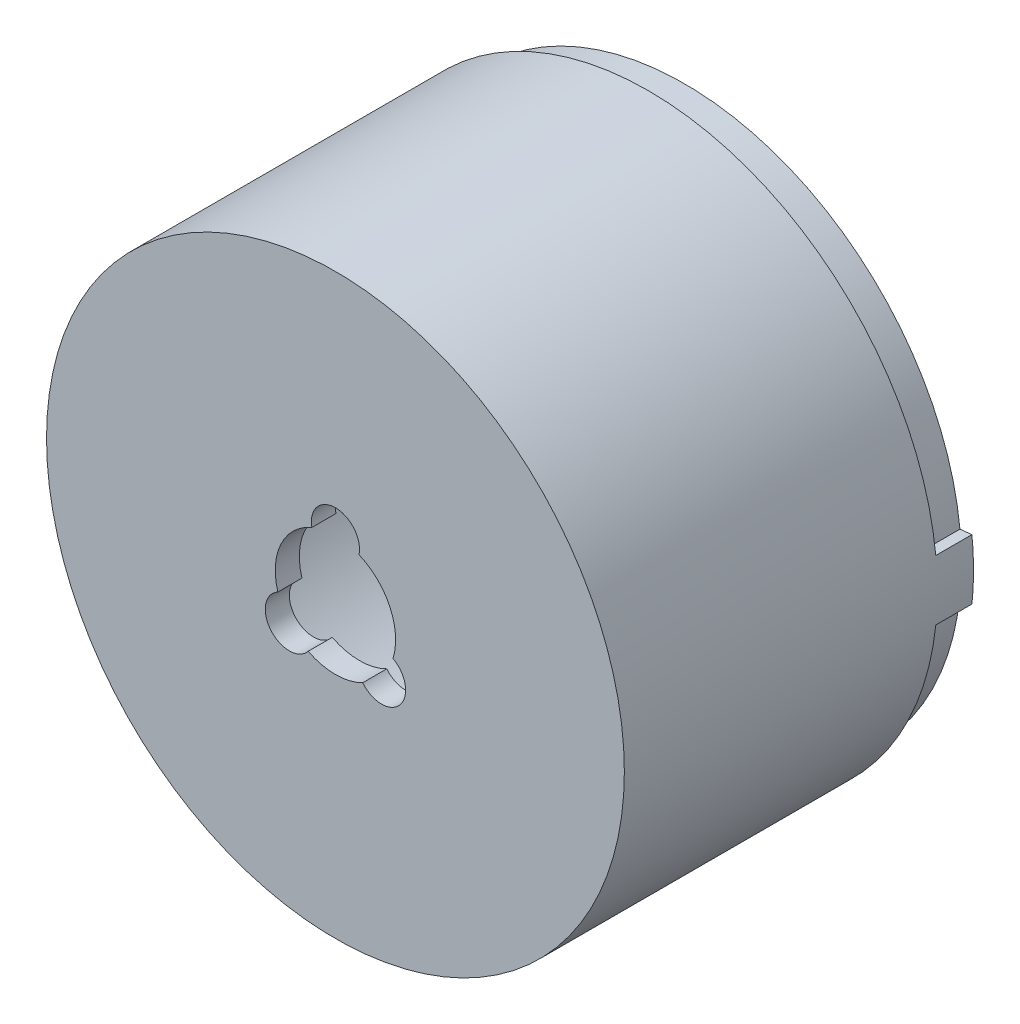
ISO-10303-21;
HEADER;
FILE_DESCRIPTION(('STEP AP214'),'2;1');
FILE_NAME('part.step','',(''),(''),'','','');
FILE_SCHEMA(('AUTOMOTIVE_DESIGN { 1 0 10303 214 1 1 1 1 }'));
ENDSEC;
DATA;
#1=APPLICATION_CONTEXT('core data for automotive mechanical design processes');
#2=APPLICATION_PROTOCOL_DEFINITION('international standard','automotive_design',2000,#1);
#3=PRODUCT_CONTEXT('',#1,'mechanical');
#4=PRODUCT('Part','Part','',(#3));
#5=PRODUCT_RELATED_PRODUCT_CATEGORY('part','',(#4));
#6=PRODUCT_DEFINITION_FORMATION('','',#4);
#7=PRODUCT_DEFINITION_CONTEXT('part definition',#1,'design');
#8=PRODUCT_DEFINITION('design','',#6,#7);
#9=PRODUCT_DEFINITION_SHAPE('','',#8);
#10=(LENGTH_UNIT() NAMED_UNIT(*) SI_UNIT(.MILLI.,.METRE.));
#11=(NAMED_UNIT(*) PLANE_ANGLE_UNIT() SI_UNIT($,.RADIAN.));
#12=(NAMED_UNIT(*) SI_UNIT($,.STERADIAN.) SOLID_ANGLE_UNIT());
#13=UNCERTAINTY_MEASURE_WITH_UNIT(LENGTH_MEASURE(1.E-05),#10,'distance_accuracy_value','');
#14=(GEOMETRIC_REPRESENTATION_CONTEXT(3) GLOBAL_UNCERTAINTY_ASSIGNED_CONTEXT((#13)) GLOBAL_UNIT_ASSIGNED_CONTEXT((#10,
#11,#12)) REPRESENTATION_CONTEXT('',''));
#15=CARTESIAN_POINT('',(0.,0.,0.));
#16=DIRECTION('',(0.,0.,1.));
#17=DIRECTION('',(1.,0.,0.));
#18=AXIS2_PLACEMENT_3D('',#15,#16,#17);
#19=CARTESIAN_POINT('',(0.,0.,33.8));
#20=DIRECTION('',(0.,0.,-1.));
#21=DIRECTION('',(-1.,0.,0.));
#22=AXIS2_PLACEMENT_3D('',#19,#20,#21);
#23=PLANE('',#22);
#24=CARTESIAN_POINT('',(0.,0.,33.8));
#25=DIRECTION('',(0.,0.,-1.));
#26=DIRECTION('',(-1.,0.,0.));
#27=AXIS2_PLACEMENT_3D('',#24,#25,#26);
#28=CIRCLE('',#27,23.);
#29=CARTESIAN_POINT('',(22.87487666937,-2.39583333333334,33.8));
#30=VERTEX_POINT('',#29);
#31=CARTESIAN_POINT('',(-22.87487666937,-2.39583333333333,33.8));
#32=VERTEX_POINT('',#31);
#33=EDGE_CURVE('E272',#30,#32,#28,.T.);
#34=ORIENTED_EDGE('',*,*,#33,.F.);
#35=DIRECTION('',(-0.994559855190001,0.104166666666667,0.));
#36=VECTOR('',#35,1.);
#37=CARTESIAN_POINT('',(0.,0.,33.8));
#38=LINE('',#37,#36);
#39=CARTESIAN_POINT('',(23.86943652456,-2.50000000000001,33.8));
#40=VERTEX_POINT('',#39);
#41=EDGE_CURVE('E452',#40,#30,#38,.T.);
#42=ORIENTED_EDGE('',*,*,#41,.F.);
#43=CARTESIAN_POINT('',(0.,0.,33.8));
#44=DIRECTION('',(0.,0.,-1.));
#45=DIRECTION('',(-1.,0.,0.));
#46=AXIS2_PLACEMENT_3D('',#43,#44,#45);
#47=CIRCLE('',#46,24.);
#48=CARTESIAN_POINT('',(-23.86943652456,-2.5,33.8));
#49=VERTEX_POINT('',#48);
#50=EDGE_CURVE('E226',#40,#49,#47,.T.);
#51=ORIENTED_EDGE('',*,*,#50,.T.);
#52=DIRECTION('',(-0.994559855190001,-0.104166666666667,0.));
#53=VECTOR('',#52,1.);
#54=CARTESIAN_POINT('',(0.,0.,33.8));
#55=LINE('',#54,#53);
#56=EDGE_CURVE('E229',#32,#49,#55,.T.);
#57=ORIENTED_EDGE('',*,*,#56,.F.);
#58=EDGE_LOOP('',(#34,#42,#51,#57));
#59=FACE_BOUND('',#58,.T.);
#60=ADVANCED_FACE('F41',(#59),#23,.T.);
#61=CARTESIAN_POINT('',(0.,0.,33.8));
#62=DIRECTION('',(0.,0.,-1.));
#63=DIRECTION('',(-1.,0.,0.));
#64=AXIS2_PLACEMENT_3D('',#61,#62,#63);
#65=CYLINDRICAL_SURFACE('',#64,23.);
#66=CARTESIAN_POINT('',(0.,0.,30.8));
#67=DIRECTION('',(0.,0.,-1.));
#68=DIRECTION('',(-1.,0.,0.));
#69=AXIS2_PLACEMENT_3D('',#66,#67,#68);
#70=CIRCLE('',#69,23.);
#71=CARTESIAN_POINT('',(22.87487666937,-2.39583333333334,30.8));
#72=VERTEX_POINT('',#71);
#73=CARTESIAN_POINT('',(-22.87487666937,-2.39583333333333,30.8));
#74=VERTEX_POINT('',#73);
#75=EDGE_CURVE('E268',#72,#74,#70,.T.);
#76=ORIENTED_EDGE('',*,*,#75,.F.);
#77=DIRECTION('',(0.,0.,1.));
#78=VECTOR('',#77,1.);
#79=CARTESIAN_POINT('',(22.87487666937,-2.39583333333334,30.8));
#80=LINE('',#79,#78);
#81=EDGE_CURVE('E57',#72,#30,#80,.T.);
#82=ORIENTED_EDGE('',*,*,#81,.T.);
#83=ORIENTED_EDGE('',*,*,#33,.T.);
#84=DIRECTION('',(0.,0.,1.));
#85=VECTOR('',#84,1.);
#86=CARTESIAN_POINT('',(-22.87487666937,-2.39583333333333,30.8));
#87=LINE('',#86,#85);
#88=EDGE_CURVE('E250',#74,#32,#87,.T.);
#89=ORIENTED_EDGE('',*,*,#88,.F.);
#90=EDGE_LOOP('',(#76,#82,#83,#89));
#91=FACE_BOUND('',#90,.T.);
#92=ADVANCED_FACE('F419',(#91),#65,.T.);
#93=DIRECTION('',(-0.994559855190001,-0.104166666666667,0.));
#94=VECTOR('',#93,1.);
#95=CARTESIAN_POINT('',(0.,0.,33.8));
#96=LINE('',#95,#94);
#97=CARTESIAN_POINT('',(23.86943652456,2.5,33.8));
#98=VERTEX_POINT('',#97);
#99=CARTESIAN_POINT('',(22.87487666937,2.39583333333333,33.8));
#100=VERTEX_POINT('',#99);
#101=EDGE_CURVE('E65',#98,#100,#96,.T.);
#102=ORIENTED_EDGE('',*,*,#101,.T.);
#103=CARTESIAN_POINT('',(-22.87487666937,2.39583333333334,33.8));
#104=VERTEX_POINT('',#103);
#105=EDGE_CURVE('E269',#104,#100,#28,.T.);
#106=ORIENTED_EDGE('',*,*,#105,.F.);
#107=DIRECTION('',(-0.994559855190001,0.104166666666667,0.));
#108=VECTOR('',#107,1.);
#109=CARTESIAN_POINT('',(0.,0.,33.8));
#110=LINE('',#109,#108);
#111=CARTESIAN_POINT('',(-23.86943652456,2.50000000000001,33.8));
#112=VERTEX_POINT('',#111);
#113=EDGE_CURVE('E234',#104,#112,#110,.T.);
#114=ORIENTED_EDGE('',*,*,#113,.T.);
#115=EDGE_CURVE('E276',#112,#98,#47,.T.);
#116=ORIENTED_EDGE('',*,*,#115,.T.);
#117=EDGE_LOOP('',(#102,#106,#114,#116));
#118=FACE_BOUND('',#117,.T.);
#119=ADVANCED_FACE('F422',(#118),#23,.T.);
#120=DIRECTION('',(0.,0.,1.));
#121=VECTOR('',#120,1.);
#122=CARTESIAN_POINT('',(22.87487666937,2.39583333333333,30.8));
#123=LINE('',#122,#121);
#124=CARTESIAN_POINT('',(22.87487666937,2.39583333333333,30.8));
#125=VERTEX_POINT('',#124);
#126=EDGE_CURVE('E236',#125,#100,#123,.T.);
#127=ORIENTED_EDGE('',*,*,#126,.F.);
#128=CARTESIAN_POINT('',(-22.87487666937,2.39583333333334,30.8));
#129=VERTEX_POINT('',#128);
#130=EDGE_CURVE('E273',#129,#125,#70,.T.);
#131=ORIENTED_EDGE('',*,*,#130,.F.);
#132=DIRECTION('',(0.,0.,1.));
#133=VECTOR('',#132,1.);
#134=CARTESIAN_POINT('',(-22.87487666937,2.39583333333334,30.8));
#135=LINE('',#134,#133);
#136=EDGE_CURVE('E258',#129,#104,#135,.T.);
#137=ORIENTED_EDGE('',*,*,#136,.T.);
#138=ORIENTED_EDGE('',*,*,#105,.T.);
#139=EDGE_LOOP('',(#127,#131,#137,#138));
#140=FACE_BOUND('',#139,.T.);
#141=ADVANCED_FACE('F415',(#140),#65,.T.);
#142=CARTESIAN_POINT('',(0.,0.,30.8));
#143=DIRECTION('',(0.,0.,1.));
#144=DIRECTION('',(1.,0.,0.));
#145=AXIS2_PLACEMENT_3D('',#142,#143,#144);
#146=PLANE('',#145);
#147=CARTESIAN_POINT('',(0.,0.,30.8));
#148=DIRECTION('',(0.,0.,1.));
#149=DIRECTION('',(1.,0.,0.));
#150=AXIS2_PLACEMENT_3D('',#147,#148,#149);
#151=CIRCLE('',#150,22.2);
#152=CARTESIAN_POINT('',(22.2,0.,30.8));
#153=VERTEX_POINT('',#152);
#154=EDGE_CURVE('E11',#153,#153,#151,.F.);
#155=ORIENTED_EDGE('',*,*,#154,.F.);
#156=EDGE_LOOP('',(#155));
#157=FACE_BOUND('',#156,.T.);
#158=ORIENTED_EDGE('',*,*,#130,.T.);
#159=DIRECTION('',(-0.994559855190001,-0.104166666666667,0.));
#160=VECTOR('',#159,1.);
#161=CARTESIAN_POINT('',(0.,0.,30.8));
#162=LINE('',#161,#160);
#163=CARTESIAN_POINT('',(23.86943652456,2.5,30.8));
#164=VERTEX_POINT('',#163);
#165=EDGE_CURVE('E212',#164,#125,#162,.T.);
#166=ORIENTED_EDGE('',*,*,#165,.F.);
#167=CARTESIAN_POINT('',(0.,0.,30.8));
#168=DIRECTION('',(0.,0.,-1.));
#169=DIRECTION('',(-1.,0.,0.));
#170=AXIS2_PLACEMENT_3D('',#167,#168,#169);
#171=CIRCLE('',#170,24.);
#172=CARTESIAN_POINT('',(23.86943652456,-2.50000000000001,30.8));
#173=VERTEX_POINT('',#172);
#174=EDGE_CURVE('E213',#164,#173,#171,.T.);
#175=ORIENTED_EDGE('',*,*,#174,.T.);
#176=DIRECTION('',(-0.994559855190001,0.104166666666667,0.));
#177=VECTOR('',#176,1.);
#178=CARTESIAN_POINT('',(0.,0.,30.8));
#179=LINE('',#178,#177);
#180=EDGE_CURVE('E204',#173,#72,#179,.T.);
#181=ORIENTED_EDGE('',*,*,#180,.T.);
#182=ORIENTED_EDGE('',*,*,#75,.T.);
#183=DIRECTION('',(-0.994559855190001,-0.104166666666667,0.));
#184=VECTOR('',#183,1.);
#185=CARTESIAN_POINT('',(0.,0.,30.8));
#186=LINE('',#185,#184);
#187=CARTESIAN_POINT('',(-23.86943652456,-2.5,30.8));
#188=VERTEX_POINT('',#187);
#189=EDGE_CURVE('E240',#74,#188,#186,.T.);
#190=ORIENTED_EDGE('',*,*,#189,.T.);
#191=CARTESIAN_POINT('',(0.,0.,30.8));
#192=DIRECTION('',(0.,0.,-1.));
#193=DIRECTION('',(-1.,0.,0.));
#194=AXIS2_PLACEMENT_3D('',#191,#192,#193);
#195=CIRCLE('',#194,24.);
#196=CARTESIAN_POINT('',(-23.86943652456,2.50000000000001,30.8));
#197=VERTEX_POINT('',#196);
#198=EDGE_CURVE('E244',#188,#197,#195,.T.);
#199=ORIENTED_EDGE('',*,*,#198,.T.);
#200=DIRECTION('',(-0.994559855190001,0.104166666666667,0.));
#201=VECTOR('',#200,1.);
#202=CARTESIAN_POINT('',(0.,0.,30.8));
#203=LINE('',#202,#201);
#204=EDGE_CURVE('E247',#129,#197,#203,.T.);
#205=ORIENTED_EDGE('',*,*,#204,.F.);
#206=EDGE_LOOP('',(#158,#166,#175,#181,#182,#190,#199,#205));
#207=FACE_BOUND('',#206,.T.);
#208=ADVANCED_FACE('F43',(#157,#207),#146,.F.);
#209=CARTESIAN_POINT('',(0.,0.,1072.38147752167));
#210=DIRECTION('',(0.,0.,1.));
#211=DIRECTION('',(1.,0.,0.));
#212=AXIS2_PLACEMENT_3D('',#209,#210,#211);
#213=CYLINDRICAL_SURFACE('',#212,24.);
#214=CARTESIAN_POINT('',(0.,0.,59.8000000000001));
#215=DIRECTION('',(0.,0.,1.));
#216=DIRECTION('',(1.,0.,0.));
#217=AXIS2_PLACEMENT_3D('',#214,#215,#216);
#218=CIRCLE('',#217,24.);
#219=CARTESIAN_POINT('',(24.,0.,59.8000000000001));
#220=VERTEX_POINT('',#219);
#221=EDGE_CURVE('E50',#220,#220,#218,.T.);
#222=ORIENTED_EDGE('',*,*,#221,.F.);
#223=EDGE_LOOP('',(#222));
#224=FACE_BOUND('',#223,.T.);
#225=ORIENTED_EDGE('',*,*,#115,.F.);
#226=DIRECTION('',(0.,0.,1.));
#227=VECTOR('',#226,1.);
#228=CARTESIAN_POINT('',(-23.86943652456,2.50000000000001,30.8));
#229=LINE('',#228,#227);
#230=EDGE_CURVE('E262',#197,#112,#229,.T.);
#231=ORIENTED_EDGE('',*,*,#230,.F.);
#232=ORIENTED_EDGE('',*,*,#198,.F.);
#233=DIRECTION('',(0.,0.,1.));
#234=VECTOR('',#233,1.);
#235=CARTESIAN_POINT('',(-23.86943652456,-2.5,30.8));
#236=LINE('',#235,#234);
#237=EDGE_CURVE('E265',#188,#49,#236,.T.);
#238=ORIENTED_EDGE('',*,*,#237,.T.);
#239=ORIENTED_EDGE('',*,*,#50,.F.);
#240=DIRECTION('',(0.,0.,1.));
#241=VECTOR('',#240,1.);
#242=CARTESIAN_POINT('',(23.86943652456,-2.50000000000001,30.8));
#243=LINE('',#242,#241);
#244=EDGE_CURVE('E209',#173,#40,#243,.T.);
#245=ORIENTED_EDGE('',*,*,#244,.F.);
#246=ORIENTED_EDGE('',*,*,#174,.F.);
#247=DIRECTION('',(0.,0.,1.));
#248=VECTOR('',#247,1.);
#249=CARTESIAN_POINT('',(23.86943652456,2.5,30.8));
#250=LINE('',#249,#248);
#251=EDGE_CURVE('E450',#164,#98,#250,.T.);
#252=ORIENTED_EDGE('',*,*,#251,.T.);
#253=EDGE_LOOP('',(#225,#231,#232,#238,#239,#245,#246,#252));
#254=FACE_BOUND('',#253,.T.);
#255=ADVANCED_FACE('F224',(#224,#254),#213,.T.);
#256=CARTESIAN_POINT('',(0.,0.,57.8));
#257=DIRECTION('',(0.,0.,1.));
#258=DIRECTION('',(1.,0.,0.));
#259=AXIS2_PLACEMENT_3D('',#256,#257,#258);
#260=PLANE('',#259);
#261=CARTESIAN_POINT('',(0.,0.,57.8000000000001));
#262=DIRECTION('',(0.,0.,1.));
#263=DIRECTION('',(1.,0.,0.));
#264=AXIS2_PLACEMENT_3D('',#261,#262,#263);
#265=CIRCLE('',#264,17.);
#266=CARTESIAN_POINT('',(17.,0.,57.8000000000001));
#267=VERTEX_POINT('',#266);
#268=EDGE_CURVE('E539',#267,#267,#265,.T.);
#269=ORIENTED_EDGE('',*,*,#268,.F.);
#270=EDGE_LOOP('',(#269));
#271=FACE_BOUND('',#270,.T.);
#272=CARTESIAN_POINT('',(0.,0.,57.8000000000001));
#273=DIRECTION('',(0.,0.,1.));
#274=DIRECTION('',(1.,0.,0.));
#275=AXIS2_PLACEMENT_3D('',#272,#273,#274);
#276=CIRCLE('',#275,5.);
#277=CARTESIAN_POINT('',(-1.95959179422654,4.6,57.8));
#278=VERTEX_POINT('',#277);
#279=CARTESIAN_POINT('',(-4.78340576371954,-1.45568859980928,57.8));
#280=VERTEX_POINT('',#279);
#281=EDGE_CURVE('E549',#278,#280,#276,.T.);
#282=ORIENTED_EDGE('',*,*,#281,.T.);
#283=CARTESIAN_POINT('',(-3.8302222155949,-3.21393804843269,57.8));
#284=DIRECTION('',(0.,0.,1.));
#285=DIRECTION('',(1.,0.,0.));
#286=AXIS2_PLACEMENT_3D('',#283,#284,#285);
#287=CIRCLE('',#286,2.);
#288=CARTESIAN_POINT('',(-2.26420311297507,-4.45795740930687,57.8));
#289=VERTEX_POINT('',#288);
#290=EDGE_CURVE('E289',#289,#280,#287,.F.);
#291=ORIENTED_EDGE('',*,*,#290,.F.);
#292=CARTESIAN_POINT('',(2.26420311297507,-4.45795740930687,57.8));
#293=VERTEX_POINT('',#292);
#294=EDGE_CURVE('E547',#289,#293,#276,.T.);
#295=ORIENTED_EDGE('',*,*,#294,.T.);
#296=CARTESIAN_POINT('',(3.8302222155949,-3.21393804843269,57.8));
#297=DIRECTION('',(0.,0.,1.));
#298=DIRECTION('',(1.,0.,0.));
#299=AXIS2_PLACEMENT_3D('',#296,#297,#298);
#300=CIRCLE('',#299,2.);
#301=CARTESIAN_POINT('',(4.78340576371954,-1.45568859980928,57.8));
#302=VERTEX_POINT('',#301);
#303=EDGE_CURVE('E299',#302,#293,#300,.F.);
#304=ORIENTED_EDGE('',*,*,#303,.F.);
#305=CARTESIAN_POINT('',(1.95959179422654,4.6,57.8));
#306=VERTEX_POINT('',#305);
#307=EDGE_CURVE('E543',#302,#306,#276,.T.);
#308=ORIENTED_EDGE('',*,*,#307,.T.);
#309=CARTESIAN_POINT('',(0.,5.,57.8));
#310=DIRECTION('',(0.,0.,1.));
#311=DIRECTION('',(1.,0.,0.));
#312=AXIS2_PLACEMENT_3D('',#309,#310,#311);
#313=CIRCLE('',#312,2.);
#314=EDGE_CURVE('E284',#278,#306,#313,.F.);
#315=ORIENTED_EDGE('',*,*,#314,.F.);
#316=EDGE_LOOP('',(#282,#291,#295,#304,#308,#315));
#317=FACE_BOUND('',#316,.T.);
#318=ADVANCED_FACE('F391',(#271,#317),#260,.F.);
#319=CARTESIAN_POINT('',(0.,0.,31.8));
#320=DIRECTION('',(0.,0.,1.));
#321=DIRECTION('',(1.,0.,0.));
#322=AXIS2_PLACEMENT_3D('',#319,#320,#321);
#323=PLANE('',#322);
#324=DIRECTION('',(-0.712282212776737,-0.701893189425482,0.));
#325=VECTOR('',#324,1.);
#326=CARTESIAN_POINT('',(-10.4776887180417,10.6327735007392,31.8));
#327=LINE('',#326,#325);
#328=CARTESIAN_POINT('',(-4.50526886810057,16.5180823598799,31.8));
#329=VERTEX_POINT('',#328);
#330=CARTESIAN_POINT('',(-4.68397596917369,16.3419817990415,31.8));
#331=VERTEX_POINT('',#330);
#332=EDGE_CURVE('E353',#329,#331,#327,.T.);
#333=ORIENTED_EDGE('',*,*,#332,.F.);
#334=CARTESIAN_POINT('',(-1.,19.9722249756745,31.8));
#335=CARTESIAN_POINT('',(-1.83751743884076,19.9722249756745,31.8));
#336=CARTESIAN_POINT('',(-3.40068888477795,17.6065514435698,31.8));
#337=CARTESIAN_POINT('',(-4.50526886810057,16.5180823598799,31.8));
#338=B_SPLINE_CURVE_WITH_KNOTS('',3,(#334,#335,#336,#337),.UNSPECIFIED.,.F.,.F.,(4,4),(0.,1.),.UNSPECIFIED.);
#339=CARTESIAN_POINT('',(-1.,19.9722249756745,31.8));
#340=VERTEX_POINT('',#339);
#341=EDGE_CURVE('E347',#340,#329,#338,.T.);
#342=ORIENTED_EDGE('',*,*,#341,.F.);
#343=DIRECTION('',(1.,0.,0.));
#344=VECTOR('',#343,1.);
#345=CARTESIAN_POINT('',(0.,19.9722249756745,31.8));
#346=LINE('',#345,#344);
#347=CARTESIAN_POINT('',(1.,19.9722249756745,31.8));
#348=VERTEX_POINT('',#347);
#349=EDGE_CURVE('E341',#340,#348,#346,.T.);
#350=ORIENTED_EDGE('',*,*,#349,.T.);
#351=CARTESIAN_POINT('',(1.,19.9722249756745,31.8));
#352=CARTESIAN_POINT('',(1.83751743884076,19.9722249756745,31.8));
#353=CARTESIAN_POINT('',(3.40068888477795,17.6065514435698,31.8));
#354=CARTESIAN_POINT('',(4.50526886810057,16.5180823598799,31.8));
#355=B_SPLINE_CURVE_WITH_KNOTS('',3,(#351,#352,#353,#354),.UNSPECIFIED.,.F.,.F.,(4,4),(0.,1.),.UNSPECIFIED.);
#356=CARTESIAN_POINT('',(4.50526886810057,16.5180823598799,31.8));
#357=VERTEX_POINT('',#356);
#358=EDGE_CURVE('E336',#348,#357,#355,.T.);
#359=ORIENTED_EDGE('',*,*,#358,.T.);
#360=DIRECTION('',(0.712282212776737,-0.701893189425482,0.));
#361=VECTOR('',#360,1.);
#362=CARTESIAN_POINT('',(10.4776887180417,10.6327735007392,31.8));
#363=LINE('',#362,#361);
#364=CARTESIAN_POINT('',(4.68397596917369,16.3419817990415,31.8));
#365=VERTEX_POINT('',#364);
#366=EDGE_CURVE('E333',#357,#365,#363,.T.);
#367=ORIENTED_EDGE('',*,*,#366,.T.);
#368=CARTESIAN_POINT('',(0.,0.,31.8000000000001));
#369=DIRECTION('',(0.,0.,1.));
#370=DIRECTION('',(1.,0.,0.));
#371=AXIS2_PLACEMENT_3D('',#368,#369,#370);
#372=CIRCLE('',#371,17.);
#373=EDGE_CURVE('E360',#331,#365,#372,.F.);
#374=ORIENTED_EDGE('',*,*,#373,.F.);
#375=EDGE_LOOP('',(#333,#342,#350,#359,#367,#374));
#376=FACE_BOUND('',#375,.T.);
#377=ADVANCED_FACE('F394',(#376),#323,.F.);
#378=CARTESIAN_POINT('',(0.,19.9722249756745,28.8));
#379=DIRECTION('',(0.,-1.,0.));
#380=DIRECTION('',(0.,0.,-1.));
#381=AXIS2_PLACEMENT_3D('',#378,#379,#380);
#382=PLANE('',#381);
#383=DIRECTION('',(0.,0.,1.));
#384=VECTOR('',#383,1.);
#385=CARTESIAN_POINT('',(1.,19.9722249756745,28.8));
#386=LINE('',#385,#384);
#387=CARTESIAN_POINT('',(1.,19.9722249756745,32.8));
#388=VERTEX_POINT('',#387);
#389=EDGE_CURVE('E512',#348,#388,#386,.T.);
#390=ORIENTED_EDGE('',*,*,#389,.F.);
#391=ORIENTED_EDGE('',*,*,#349,.F.);
#392=DIRECTION('',(0.,0.,1.));
#393=VECTOR('',#392,1.);
#394=CARTESIAN_POINT('',(-1.,19.9722249756745,28.8));
#395=LINE('',#394,#393);
#396=CARTESIAN_POINT('',(-1.,19.9722249756745,32.8));
#397=VERTEX_POINT('',#396);
#398=EDGE_CURVE('E509',#340,#397,#395,.T.);
#399=ORIENTED_EDGE('',*,*,#398,.T.);
#400=DIRECTION('',(1.,0.,0.));
#401=VECTOR('',#400,1.);
#402=CARTESIAN_POINT('',(0.,19.9722249756745,32.8));
#403=LINE('',#402,#401);
#404=EDGE_CURVE('E474',#397,#388,#403,.T.);
#405=ORIENTED_EDGE('',*,*,#404,.T.);
#406=EDGE_LOOP('',(#390,#391,#399,#405));
#407=FACE_BOUND('',#406,.T.);
#408=ADVANCED_FACE('F384',(#407),#382,.F.);
#409=CARTESIAN_POINT('',(1.,19.9722249756745,28.8));
#410=CARTESIAN_POINT('',(1.83751743884076,19.9722249756745,28.8));
#411=CARTESIAN_POINT('',(3.40068888477795,17.6065514435698,28.8));
#412=CARTESIAN_POINT('',(4.50526886810057,16.5180823598799,28.8));
#413=B_SPLINE_CURVE_WITH_KNOTS('',3,(#409,#410,#411,#412),.UNSPECIFIED.,.F.,.F.,(4,4),(0.,1.),.UNSPECIFIED.);
#414=DIRECTION('',(0.,0.,1.));
#415=VECTOR('',#414,1.);
#416=SURFACE_OF_LINEAR_EXTRUSION('',#413,#415);
#417=DIRECTION('',(0.,0.,1.));
#418=VECTOR('',#417,1.);
#419=CARTESIAN_POINT('',(4.50526886810057,16.5180823598799,28.8));
#420=LINE('',#419,#418);
#421=CARTESIAN_POINT('',(4.50526886810057,16.5180823598799,32.8));
#422=VERTEX_POINT('',#421);
#423=EDGE_CURVE('E515',#357,#422,#420,.T.);
#424=ORIENTED_EDGE('',*,*,#423,.F.);
#425=ORIENTED_EDGE('',*,*,#358,.F.);
#426=ORIENTED_EDGE('',*,*,#389,.T.);
#427=CARTESIAN_POINT('',(1.,19.9722249756745,32.8));
#428=CARTESIAN_POINT('',(1.83751743884076,19.9722249756745,32.8));
#429=CARTESIAN_POINT('',(3.40068888477795,17.6065514435698,32.8));
#430=CARTESIAN_POINT('',(4.50526886810057,16.5180823598799,32.8));
#431=B_SPLINE_CURVE_WITH_KNOTS('',3,(#427,#428,#429,#430),.UNSPECIFIED.,.F.,.F.,(4,4),(0.,1.),.UNSPECIFIED.);
#432=EDGE_CURVE('E477',#388,#422,#431,.T.);
#433=ORIENTED_EDGE('',*,*,#432,.T.);
#434=EDGE_LOOP('',(#424,#425,#426,#433));
#435=FACE_BOUND('',#434,.T.);
#436=ADVANCED_FACE('F634',(#435),#416,.F.);
#437=CARTESIAN_POINT('',(10.4776887180417,10.6327735007392,28.8));
#438=DIRECTION('',(-0.701893189425482,-0.712282212776737,0.));
#439=DIRECTION('',(0.712282212776737,-0.701893189425482,0.));
#440=AXIS2_PLACEMENT_3D('',#437,#438,#439);
#441=PLANE('',#440);
#442=DIRECTION('',(0.,0.,1.));
#443=VECTOR('',#442,1.);
#444=CARTESIAN_POINT('',(4.68397596917369,16.3419817990415,28.8));
#445=LINE('',#444,#443);
#446=CARTESIAN_POINT('',(4.68397596917369,16.3419817990415,32.8));
#447=VERTEX_POINT('',#446);
#448=EDGE_CURVE('E518',#365,#447,#445,.T.);
#449=ORIENTED_EDGE('',*,*,#448,.F.);
#450=ORIENTED_EDGE('',*,*,#366,.F.);
#451=ORIENTED_EDGE('',*,*,#423,.T.);
#452=DIRECTION('',(0.712282212776737,-0.701893189425482,0.));
#453=VECTOR('',#452,1.);
#454=CARTESIAN_POINT('',(10.4776887180417,10.6327735007392,32.8));
#455=LINE('',#454,#453);
#456=EDGE_CURVE('E481',#422,#447,#455,.T.);
#457=ORIENTED_EDGE('',*,*,#456,.T.);
#458=EDGE_LOOP('',(#449,#450,#451,#457));
#459=FACE_BOUND('',#458,.T.);
#460=ADVANCED_FACE('F389',(#459),#441,.F.);
#461=CARTESIAN_POINT('',(0.,0.,1072.38147752167));
#462=DIRECTION('',(0.,0.,1.));
#463=DIRECTION('',(1.,0.,0.));
#464=AXIS2_PLACEMENT_3D('',#461,#462,#463);
#465=CYLINDRICAL_SURFACE('',#464,17.);
#466=ORIENTED_EDGE('',*,*,#268,.T.);
#467=EDGE_LOOP('',(#466));
#468=FACE_BOUND('',#467,.T.);
#469=DIRECTION('',(0.,0.,1.));
#470=VECTOR('',#469,1.);
#471=CARTESIAN_POINT('',(-4.68397596917369,16.3419817990415,28.8));
#472=LINE('',#471,#470);
#473=CARTESIAN_POINT('',(-4.68397596917369,16.3419817990415,32.7999999999999));
#474=VERTEX_POINT('',#473);
#475=EDGE_CURVE('E521',#331,#474,#472,.T.);
#476=ORIENTED_EDGE('',*,*,#475,.F.);
#477=ORIENTED_EDGE('',*,*,#373,.T.);
#478=ORIENTED_EDGE('',*,*,#448,.T.);
#479=CARTESIAN_POINT('',(0.,0.,32.8));
#480=DIRECTION('',(0.,0.,1.));
#481=DIRECTION('',(1.,0.,0.));
#482=AXIS2_PLACEMENT_3D('',#479,#480,#481);
#483=CIRCLE('',#482,17.);
#484=EDGE_CURVE('E485',#474,#447,#483,.T.);
#485=ORIENTED_EDGE('',*,*,#484,.F.);
#486=EDGE_LOOP('',(#476,#477,#478,#485));
#487=FACE_BOUND('',#486,.T.);
#488=ADVANCED_FACE('F386',(#468,#487),#465,.F.);
#489=CARTESIAN_POINT('',(-10.4776887180417,10.6327735007392,28.8));
#490=DIRECTION('',(-0.701893189425482,0.712282212776737,0.));
#491=DIRECTION('',(-0.712282212776737,-0.701893189425482,0.));
#492=AXIS2_PLACEMENT_3D('',#489,#490,#491);
#493=PLANE('',#492);
#494=ORIENTED_EDGE('',*,*,#332,.T.);
#495=ORIENTED_EDGE('',*,*,#475,.T.);
#496=DIRECTION('',(-0.712282212776737,-0.701893189425482,0.));
#497=VECTOR('',#496,1.);
#498=CARTESIAN_POINT('',(-10.4776887180417,10.6327735007392,32.8));
#499=LINE('',#498,#497);
#500=CARTESIAN_POINT('',(-4.50526886810057,16.5180823598799,32.8));
#501=VERTEX_POINT('',#500);
#502=EDGE_CURVE('E489',#501,#474,#499,.T.);
#503=ORIENTED_EDGE('',*,*,#502,.F.);
#504=DIRECTION('',(0.,0.,1.));
#505=VECTOR('',#504,1.);
#506=CARTESIAN_POINT('',(-4.50526886810057,16.5180823598799,28.8));
#507=LINE('',#506,#505);
#508=EDGE_CURVE('E524',#329,#501,#507,.T.);
#509=ORIENTED_EDGE('',*,*,#508,.F.);
#510=EDGE_LOOP('',(#494,#495,#503,#509));
#511=FACE_BOUND('',#510,.T.);
#512=ADVANCED_FACE('F382',(#511),#493,.T.);
#513=CARTESIAN_POINT('',(-1.,19.9722249756745,28.8));
#514=CARTESIAN_POINT('',(-1.83751743884076,19.9722249756745,28.8));
#515=CARTESIAN_POINT('',(-3.40068888477795,17.6065514435698,28.8));
#516=CARTESIAN_POINT('',(-4.50526886810057,16.5180823598799,28.8));
#517=B_SPLINE_CURVE_WITH_KNOTS('',3,(#513,#514,#515,#516),.UNSPECIFIED.,.F.,.F.,(4,4),(0.,1.),.UNSPECIFIED.);
#518=DIRECTION('',(0.,0.,1.));
#519=VECTOR('',#518,1.);
#520=SURFACE_OF_LINEAR_EXTRUSION('',#517,#519);
#521=ORIENTED_EDGE('',*,*,#341,.T.);
#522=ORIENTED_EDGE('',*,*,#508,.T.);
#523=CARTESIAN_POINT('',(-1.,19.9722249756745,32.8));
#524=CARTESIAN_POINT('',(-1.83751743884076,19.9722249756745,32.8));
#525=CARTESIAN_POINT('',(-3.40068888477795,17.6065514435698,32.8));
#526=CARTESIAN_POINT('',(-4.50526886810057,16.5180823598799,32.8));
#527=B_SPLINE_CURVE_WITH_KNOTS('',3,(#523,#524,#525,#526),.UNSPECIFIED.,.F.,.F.,(4,4),(0.,1.),.UNSPECIFIED.);
#528=EDGE_CURVE('E364',#397,#501,#527,.T.);
#529=ORIENTED_EDGE('',*,*,#528,.F.);
#530=ORIENTED_EDGE('',*,*,#398,.F.);
#531=EDGE_LOOP('',(#521,#522,#529,#530));
#532=FACE_BOUND('',#531,.T.);
#533=ADVANCED_FACE('F377',(#532),#520,.T.);
#534=CARTESIAN_POINT('',(0.,0.,28.8));
#535=DIRECTION('',(0.,0.,1.));
#536=DIRECTION('',(1.,0.,0.));
#537=AXIS2_PLACEMENT_3D('',#534,#535,#536);
#538=CYLINDRICAL_SURFACE('',#537,19.2);
#539=CARTESIAN_POINT('',(0.,0.,31.8));
#540=DIRECTION('',(0.,0.,1.));
#541=DIRECTION('',(1.,0.,0.));
#542=AXIS2_PLACEMENT_3D('',#539,#540,#541);
#543=CIRCLE('',#542,19.2);
#544=CARTESIAN_POINT('',(6.56678675185322,18.0420983190894,31.8));
#545=VERTEX_POINT('',#544);
#546=CARTESIAN_POINT('',(-6.56678675185351,18.0420983190894,31.8));
#547=VERTEX_POINT('',#546);
#548=EDGE_CURVE('E329',#545,#547,#543,.F.);
#549=ORIENTED_EDGE('',*,*,#548,.T.);
#550=DIRECTION('',(0.,0.,1.));
#551=VECTOR('',#550,1.);
#552=CARTESIAN_POINT('',(-6.56678675185351,18.0420983190894,28.8));
#553=LINE('',#552,#551);
#554=CARTESIAN_POINT('',(-6.56678675185351,18.0420983190894,32.8));
#555=VERTEX_POINT('',#554);
#556=EDGE_CURVE('E533',#547,#555,#553,.T.);
#557=ORIENTED_EDGE('',*,*,#556,.T.);
#558=CARTESIAN_POINT('',(0.,0.,32.8));
#559=DIRECTION('',(0.,0.,1.));
#560=DIRECTION('',(1.,0.,0.));
#561=AXIS2_PLACEMENT_3D('',#558,#559,#560);
#562=CIRCLE('',#561,19.2);
#563=CARTESIAN_POINT('',(6.56678675185322,18.0420983190894,32.8));
#564=VERTEX_POINT('',#563);
#565=EDGE_CURVE('E505',#564,#555,#562,.F.);
#566=ORIENTED_EDGE('',*,*,#565,.F.);
#567=DIRECTION('',(0.,0.,1.));
#568=VECTOR('',#567,1.);
#569=CARTESIAN_POINT('',(6.56678675185322,18.0420983190894,28.8));
#570=LINE('',#569,#568);
#571=EDGE_CURVE('E536',#545,#564,#570,.T.);
#572=ORIENTED_EDGE('',*,*,#571,.F.);
#573=EDGE_LOOP('',(#549,#557,#566,#572));
#574=FACE_BOUND('',#573,.T.);
#575=ADVANCED_FACE('F381',(#574),#538,.F.);
#576=CARTESIAN_POINT('',(0.,0.,32.8));
#577=DIRECTION('',(0.,0.,1.));
#578=DIRECTION('',(1.,0.,0.));
#579=AXIS2_PLACEMENT_3D('',#576,#577,#578);
#580=PLANE('',#579);
#581=ORIENTED_EDGE('',*,*,#528,.T.);
#582=ORIENTED_EDGE('',*,*,#502,.T.);
#583=ORIENTED_EDGE('',*,*,#484,.T.);
#584=ORIENTED_EDGE('',*,*,#456,.F.);
#585=ORIENTED_EDGE('',*,*,#432,.F.);
#586=ORIENTED_EDGE('',*,*,#404,.F.);
#587=EDGE_LOOP('',(#581,#582,#583,#584,#585,#586));
#588=FACE_BOUND('',#587,.T.);
#589=DIRECTION('',(0.342020143325687,0.939692620785902,0.));
#590=VECTOR('',#589,1.);
#591=CARTESIAN_POINT('',(0.,0.,32.8));
#592=LINE('',#591,#590);
#593=CARTESIAN_POINT('',(7.59284718183028,20.8611761814471,32.8));
#594=VERTEX_POINT('',#593);
#595=EDGE_CURVE('E493',#564,#594,#592,.T.);
#596=ORIENTED_EDGE('',*,*,#595,.F.);
#597=ORIENTED_EDGE('',*,*,#565,.T.);
#598=DIRECTION('',(-0.342020143325699,0.939692620785897,0.));
#599=VECTOR('',#598,1.);
#600=CARTESIAN_POINT('',(0.,0.,32.8));
#601=LINE('',#600,#599);
#602=CARTESIAN_POINT('',(-7.5928471818306,20.8611761814471,32.8));
#603=VERTEX_POINT('',#602);
#604=EDGE_CURVE('E501',#555,#603,#601,.T.);
#605=ORIENTED_EDGE('',*,*,#604,.T.);
#606=CARTESIAN_POINT('',(0.,0.,32.8));
#607=DIRECTION('',(0.,0.,1.));
#608=DIRECTION('',(1.,0.,0.));
#609=AXIS2_PLACEMENT_3D('',#606,#607,#608);
#610=CIRCLE('',#609,22.2);
#611=EDGE_CURVE('E497',#594,#603,#610,.T.);
#612=ORIENTED_EDGE('',*,*,#611,.F.);
#613=EDGE_LOOP('',(#596,#597,#605,#612));
#614=FACE_BOUND('',#613,.T.);
#615=ADVANCED_FACE('F614',(#588,#614),#580,.F.);
#616=CARTESIAN_POINT('',(0.,0.,28.8));
#617=DIRECTION('',(0.939692620785902,-0.342020143325687,0.));
#618=DIRECTION('',(0.342020143325687,0.939692620785902,0.));
#619=AXIS2_PLACEMENT_3D('',#616,#617,#618);
#620=PLANE('',#619);
#621=DIRECTION('',(0.,0.,1.));
#622=VECTOR('',#621,1.);
#623=CARTESIAN_POINT('',(7.59284718183028,20.8611761814471,28.8));
#624=LINE('',#623,#622);
#625=CARTESIAN_POINT('',(7.59284718183028,20.8611761814471,31.8));
#626=VERTEX_POINT('',#625);
#627=EDGE_CURVE('E527',#626,#594,#624,.T.);
#628=ORIENTED_EDGE('',*,*,#627,.F.);
#629=DIRECTION('',(0.342020143325687,0.939692620785902,0.));
#630=VECTOR('',#629,1.);
#631=CARTESIAN_POINT('',(0.,0.,31.8));
#632=LINE('',#631,#630);
#633=EDGE_CURVE('E325',#545,#626,#632,.T.);
#634=ORIENTED_EDGE('',*,*,#633,.F.);
#635=ORIENTED_EDGE('',*,*,#571,.T.);
#636=ORIENTED_EDGE('',*,*,#595,.T.);
#637=EDGE_LOOP('',(#628,#634,#635,#636));
#638=FACE_BOUND('',#637,.T.);
#639=ADVANCED_FACE('F609',(#638),#620,.F.);
#640=CARTESIAN_POINT('',(0.,0.,31.8));
#641=DIRECTION('',(0.,0.,1.));
#642=DIRECTION('',(1.,0.,0.));
#643=AXIS2_PLACEMENT_3D('',#640,#641,#642);
#644=PLANE('',#643);
#645=DIRECTION('',(-0.342020143325699,0.939692620785897,0.));
#646=VECTOR('',#645,1.);
#647=CARTESIAN_POINT('',(0.,0.,31.8));
#648=LINE('',#647,#646);
#649=CARTESIAN_POINT('',(-7.5928471818306,20.8611761814471,31.8));
#650=VERTEX_POINT('',#649);
#651=EDGE_CURVE('E294',#547,#650,#648,.T.);
#652=ORIENTED_EDGE('',*,*,#651,.F.);
#653=ORIENTED_EDGE('',*,*,#548,.F.);
#654=ORIENTED_EDGE('',*,*,#633,.T.);
#655=CARTESIAN_POINT('',(0.,0.,31.8));
#656=DIRECTION('',(0.,0.,1.));
#657=DIRECTION('',(1.,0.,0.));
#658=AXIS2_PLACEMENT_3D('',#655,#656,#657);
#659=CIRCLE('',#658,22.2);
#660=EDGE_CURVE('E322',#650,#626,#659,.T.);
#661=ORIENTED_EDGE('',*,*,#660,.F.);
#662=EDGE_LOOP('',(#652,#653,#654,#661));
#663=FACE_BOUND('',#662,.T.);
#664=ADVANCED_FACE('F605',(#663),#644,.F.);
#665=CARTESIAN_POINT('',(0.,0.,28.8));
#666=DIRECTION('',(0.939692620785897,0.342020143325699,0.));
#667=DIRECTION('',(-0.342020143325699,0.939692620785897,0.));
#668=AXIS2_PLACEMENT_3D('',#665,#666,#667);
#669=PLANE('',#668);
#670=ORIENTED_EDGE('',*,*,#651,.T.);
#671=DIRECTION('',(0.,0.,1.));
#672=VECTOR('',#671,1.);
#673=CARTESIAN_POINT('',(-7.5928471818306,20.8611761814471,28.8));
#674=LINE('',#673,#672);
#675=EDGE_CURVE('E530',#650,#603,#674,.T.);
#676=ORIENTED_EDGE('',*,*,#675,.T.);
#677=ORIENTED_EDGE('',*,*,#604,.F.);
#678=ORIENTED_EDGE('',*,*,#556,.F.);
#679=EDGE_LOOP('',(#670,#676,#677,#678));
#680=FACE_BOUND('',#679,.T.);
#681=ADVANCED_FACE('F608',(#680),#669,.T.);
#682=CARTESIAN_POINT('',(0.,0.,28.8));
#683=DIRECTION('',(0.,0.,1.));
#684=DIRECTION('',(1.,0.,0.));
#685=AXIS2_PLACEMENT_3D('',#682,#683,#684);
#686=CYLINDRICAL_SURFACE('',#685,22.2);
#687=ORIENTED_EDGE('',*,*,#154,.T.);
#688=EDGE_LOOP('',(#687));
#689=FACE_BOUND('',#688,.T.);
#690=ORIENTED_EDGE('',*,*,#675,.F.);
#691=ORIENTED_EDGE('',*,*,#660,.T.);
#692=ORIENTED_EDGE('',*,*,#627,.T.);
#693=ORIENTED_EDGE('',*,*,#611,.T.);
#694=EDGE_LOOP('',(#690,#691,#692,#693));
#695=FACE_BOUND('',#694,.T.);
#696=ADVANCED_FACE('F602',(#689,#695),#686,.F.);
#697=CARTESIAN_POINT('',(0.,0.,1072.38147752167));
#698=DIRECTION('',(0.,0.,1.));
#699=DIRECTION('',(1.,0.,0.));
#700=AXIS2_PLACEMENT_3D('',#697,#698,#699);
#701=CYLINDRICAL_SURFACE('',#700,5.);
#702=ORIENTED_EDGE('',*,*,#294,.F.);
#703=DIRECTION('',(0.,0.,1.));
#704=VECTOR('',#703,1.);
#705=CARTESIAN_POINT('',(-2.26420311297507,-4.45795740930687,-0.001000000000001));
#706=LINE('',#705,#704);
#707=CARTESIAN_POINT('',(-2.26420311297507,-4.45795740930687,59.8));
#708=VERTEX_POINT('',#707);
#709=EDGE_CURVE('E285',#289,#708,#706,.T.);
#710=ORIENTED_EDGE('',*,*,#709,.T.);
#711=CARTESIAN_POINT('',(0.,0.,59.8000000000001));
#712=DIRECTION('',(0.,0.,1.));
#713=DIRECTION('',(1.,0.,0.));
#714=AXIS2_PLACEMENT_3D('',#711,#712,#713);
#715=CIRCLE('',#714,5.);
#716=CARTESIAN_POINT('',(2.26420311297507,-4.45795740930687,59.8));
#717=VERTEX_POINT('',#716);
#718=EDGE_CURVE('E557',#708,#717,#715,.T.);
#719=ORIENTED_EDGE('',*,*,#718,.T.);
#720=DIRECTION('',(0.,0.,1.));
#721=VECTOR('',#720,1.);
#722=CARTESIAN_POINT('',(2.26420311297507,-4.45795740930687,-0.001000000000001));
#723=LINE('',#722,#721);
#724=EDGE_CURVE('E310',#293,#717,#723,.T.);
#725=ORIENTED_EDGE('',*,*,#724,.F.);
#726=EDGE_LOOP('',(#702,#710,#719,#725));
#727=FACE_BOUND('',#726,.T.);
#728=ADVANCED_FACE('F403',(#727),#701,.F.);
#729=CARTESIAN_POINT('',(3.8302222155949,-3.21393804843269,-0.001000000000001));
#730=DIRECTION('',(0.,0.,1.));
#731=DIRECTION('',(1.,0.,0.));
#732=AXIS2_PLACEMENT_3D('',#729,#730,#731);
#733=CYLINDRICAL_SURFACE('',#732,2.);
#734=ORIENTED_EDGE('',*,*,#303,.T.);
#735=ORIENTED_EDGE('',*,*,#724,.T.);
#736=CARTESIAN_POINT('',(3.8302222155949,-3.21393804843269,59.8));
#737=DIRECTION('',(0.,0.,1.));
#738=DIRECTION('',(1.,0.,0.));
#739=AXIS2_PLACEMENT_3D('',#736,#737,#738);
#740=CIRCLE('',#739,2.);
#741=CARTESIAN_POINT('',(4.78340576371954,-1.45568859980928,59.8));
#742=VERTEX_POINT('',#741);
#743=EDGE_CURVE('E279',#717,#742,#740,.T.);
#744=ORIENTED_EDGE('',*,*,#743,.T.);
#745=DIRECTION('',(0.,0.,1.));
#746=VECTOR('',#745,1.);
#747=CARTESIAN_POINT('',(4.78340576371954,-1.45568859980928,-0.001000000000001));
#748=LINE('',#747,#746);
#749=EDGE_CURVE('E311',#302,#742,#748,.T.);
#750=ORIENTED_EDGE('',*,*,#749,.F.);
#751=EDGE_LOOP('',(#734,#735,#744,#750));
#752=FACE_BOUND('',#751,.T.);
#753=ADVANCED_FACE('F401',(#752),#733,.F.);
#754=CARTESIAN_POINT('',(1.95959179422654,4.6,59.8));
#755=VERTEX_POINT('',#754);
#756=EDGE_CURVE('E554',#742,#755,#715,.T.);
#757=ORIENTED_EDGE('',*,*,#756,.T.);
#758=DIRECTION('',(0.,0.,1.));
#759=VECTOR('',#758,1.);
#760=CARTESIAN_POINT('',(1.95959179422654,4.6,-0.001000000000001));
#761=LINE('',#760,#759);
#762=EDGE_CURVE('E298',#306,#755,#761,.T.);
#763=ORIENTED_EDGE('',*,*,#762,.F.);
#764=ORIENTED_EDGE('',*,*,#307,.F.);
#765=ORIENTED_EDGE('',*,*,#749,.T.);
#766=EDGE_LOOP('',(#757,#763,#764,#765));
#767=FACE_BOUND('',#766,.T.);
#768=ADVANCED_FACE('F397',(#767),#701,.F.);
#769=CARTESIAN_POINT('',(0.,5.,-0.001000000000001));
#770=DIRECTION('',(0.,0.,1.));
#771=DIRECTION('',(1.,0.,0.));
#772=AXIS2_PLACEMENT_3D('',#769,#770,#771);
#773=CYLINDRICAL_SURFACE('',#772,2.);
#774=ORIENTED_EDGE('',*,*,#314,.T.);
#775=ORIENTED_EDGE('',*,*,#762,.T.);
#776=CARTESIAN_POINT('',(0.,5.,59.8));
#777=DIRECTION('',(0.,0.,1.));
#778=DIRECTION('',(1.,0.,0.));
#779=AXIS2_PLACEMENT_3D('',#776,#777,#778);
#780=CIRCLE('',#779,2.);
#781=CARTESIAN_POINT('',(-1.95959179422654,4.6,59.8));
#782=VERTEX_POINT('',#781);
#783=EDGE_CURVE('E295',#755,#782,#780,.T.);
#784=ORIENTED_EDGE('',*,*,#783,.T.);
#785=DIRECTION('',(0.,0.,1.));
#786=VECTOR('',#785,1.);
#787=CARTESIAN_POINT('',(-1.95959179422654,4.6,-0.001000000000001));
#788=LINE('',#787,#786);
#789=EDGE_CURVE('E300',#278,#782,#788,.T.);
#790=ORIENTED_EDGE('',*,*,#789,.F.);
#791=EDGE_LOOP('',(#774,#775,#784,#790));
#792=FACE_BOUND('',#791,.T.);
#793=ADVANCED_FACE('F400',(#792),#773,.F.);
#794=CARTESIAN_POINT('',(-4.78340576371954,-1.45568859980928,59.8));
#795=VERTEX_POINT('',#794);
#796=EDGE_CURVE('E559',#782,#795,#715,.T.);
#797=ORIENTED_EDGE('',*,*,#796,.T.);
#798=DIRECTION('',(0.,0.,1.));
#799=VECTOR('',#798,1.);
#800=CARTESIAN_POINT('',(-4.78340576371954,-1.45568859980928,-0.001000000000001));
#801=LINE('',#800,#799);
#802=EDGE_CURVE('E283',#280,#795,#801,.T.);
#803=ORIENTED_EDGE('',*,*,#802,.F.);
#804=ORIENTED_EDGE('',*,*,#281,.F.);
#805=ORIENTED_EDGE('',*,*,#789,.T.);
#806=EDGE_LOOP('',(#797,#803,#804,#805));
#807=FACE_BOUND('',#806,.T.);
#808=ADVANCED_FACE('F404',(#807),#701,.F.);
#809=CARTESIAN_POINT('',(-3.8302222155949,-3.21393804843269,-0.001000000000001));
#810=DIRECTION('',(0.,0.,1.));
#811=DIRECTION('',(1.,0.,0.));
#812=AXIS2_PLACEMENT_3D('',#809,#810,#811);
#813=CYLINDRICAL_SURFACE('',#812,2.);
#814=ORIENTED_EDGE('',*,*,#290,.T.);
#815=ORIENTED_EDGE('',*,*,#802,.T.);
#816=CARTESIAN_POINT('',(-3.8302222155949,-3.21393804843269,59.8));
#817=DIRECTION('',(0.,0.,1.));
#818=DIRECTION('',(1.,0.,0.));
#819=AXIS2_PLACEMENT_3D('',#816,#817,#818);
#820=CIRCLE('',#819,2.);
#821=EDGE_CURVE('E280',#795,#708,#820,.T.);
#822=ORIENTED_EDGE('',*,*,#821,.T.);
#823=ORIENTED_EDGE('',*,*,#709,.F.);
#824=EDGE_LOOP('',(#814,#815,#822,#823));
#825=FACE_BOUND('',#824,.T.);
#826=ADVANCED_FACE('F407',(#825),#813,.F.);
#827=CARTESIAN_POINT('',(0.,0.,59.8));
#828=DIRECTION('',(0.,0.,1.));
#829=DIRECTION('',(1.,0.,0.));
#830=AXIS2_PLACEMENT_3D('',#827,#828,#829);
#831=PLANE('',#830);
#832=ORIENTED_EDGE('',*,*,#821,.F.);
#833=ORIENTED_EDGE('',*,*,#796,.F.);
#834=ORIENTED_EDGE('',*,*,#783,.F.);
#835=ORIENTED_EDGE('',*,*,#756,.F.);
#836=ORIENTED_EDGE('',*,*,#743,.F.);
#837=ORIENTED_EDGE('',*,*,#718,.F.);
#838=EDGE_LOOP('',(#832,#833,#834,#835,#836,#837));
#839=FACE_BOUND('',#838,.T.);
#840=ORIENTED_EDGE('',*,*,#221,.T.);
#841=EDGE_LOOP('',(#840));
#842=FACE_BOUND('',#841,.T.);
#843=ADVANCED_FACE('F405',(#839,#842),#831,.T.);
#844=CARTESIAN_POINT('',(0.,0.,30.8));
#845=DIRECTION('',(-0.104166666666667,0.994559855190001,0.));
#846=DIRECTION('',(-0.994559855190001,-0.104166666666667,0.));
#847=AXIS2_PLACEMENT_3D('',#844,#845,#846);
#848=PLANE('',#847);
#849=ORIENTED_EDGE('',*,*,#56,.T.);
#850=ORIENTED_EDGE('',*,*,#237,.F.);
#851=ORIENTED_EDGE('',*,*,#189,.F.);
#852=ORIENTED_EDGE('',*,*,#88,.T.);
#853=EDGE_LOOP('',(#849,#850,#851,#852));
#854=FACE_BOUND('',#853,.T.);
#855=ADVANCED_FACE('F396',(#854),#848,.F.);
#856=CARTESIAN_POINT('',(0.,0.,30.8));
#857=DIRECTION('',(0.104166666666667,0.994559855190001,0.));
#858=DIRECTION('',(-0.994559855190001,0.104166666666667,0.));
#859=AXIS2_PLACEMENT_3D('',#856,#857,#858);
#860=PLANE('',#859);
#861=ORIENTED_EDGE('',*,*,#113,.F.);
#862=ORIENTED_EDGE('',*,*,#136,.F.);
#863=ORIENTED_EDGE('',*,*,#204,.T.);
#864=ORIENTED_EDGE('',*,*,#230,.T.);
#865=EDGE_LOOP('',(#861,#862,#863,#864));
#866=FACE_BOUND('',#865,.T.);
#867=ADVANCED_FACE('F437',(#866),#860,.T.);
#868=CARTESIAN_POINT('',(0.,0.,30.8));
#869=DIRECTION('',(0.104166666666667,0.994559855190001,0.));
#870=DIRECTION('',(-0.994559855190001,0.104166666666667,0.));
#871=AXIS2_PLACEMENT_3D('',#868,#869,#870);
#872=PLANE('',#871);
#873=ORIENTED_EDGE('',*,*,#41,.T.);
#874=ORIENTED_EDGE('',*,*,#81,.F.);
#875=ORIENTED_EDGE('',*,*,#180,.F.);
#876=ORIENTED_EDGE('',*,*,#244,.T.);
#877=EDGE_LOOP('',(#873,#874,#875,#876));
#878=FACE_BOUND('',#877,.T.);
#879=ADVANCED_FACE('F207',(#878),#872,.F.);
#880=CARTESIAN_POINT('',(0.,0.,30.8));
#881=DIRECTION('',(-0.104166666666667,0.994559855190001,0.));
#882=DIRECTION('',(-0.994559855190001,-0.104166666666667,0.));
#883=AXIS2_PLACEMENT_3D('',#880,#881,#882);
#884=PLANE('',#883);
#885=ORIENTED_EDGE('',*,*,#101,.F.);
#886=ORIENTED_EDGE('',*,*,#251,.F.);
#887=ORIENTED_EDGE('',*,*,#165,.T.);
#888=ORIENTED_EDGE('',*,*,#126,.T.);
#889=EDGE_LOOP('',(#885,#886,#887,#888));
#890=FACE_BOUND('',#889,.T.);
#891=ADVANCED_FACE('F444',(#890),#884,.T.);
#892=CLOSED_SHELL('',(#60,#92,#119,#141,#208,#255,#318,#377,#408,#436,#460,#488,#512,#533,#575,
#615,#639,#664,#681,#696,#728,#753,#768,#793,#808,#826,#843,#855,#867,#879,#891));
#893=MANIFOLD_SOLID_BREP('B2',#892);
#894=ADVANCED_BREP_SHAPE_REPRESENTATION('',(#18,#893),#14);
#895=SHAPE_DEFINITION_REPRESENTATION(#9,#894);
ENDSEC;
END-ISO-10303-21;
